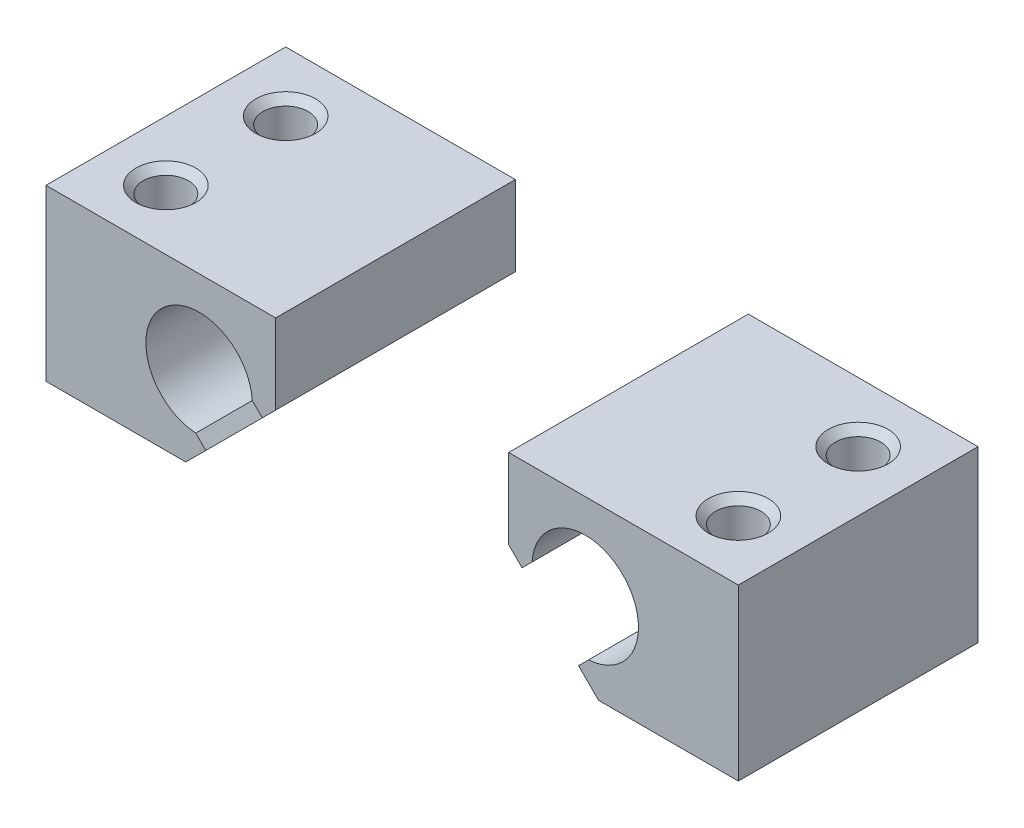
ISO-10303-21;
HEADER;
FILE_DESCRIPTION(('STEP AP214'),'2;1');
FILE_NAME('part.step','',(''),(''),'','','');
FILE_SCHEMA(('AUTOMOTIVE_DESIGN { 1 0 10303 214 1 1 1 1 }'));
ENDSEC;
DATA;
#1=APPLICATION_CONTEXT('core data for automotive mechanical design processes');
#2=APPLICATION_PROTOCOL_DEFINITION('international standard','automotive_design',2000,#1);
#3=PRODUCT_CONTEXT('',#1,'mechanical');
#4=PRODUCT('Part','Part','',(#3));
#5=PRODUCT_RELATED_PRODUCT_CATEGORY('part','',(#4));
#6=PRODUCT_DEFINITION_FORMATION('','',#4);
#7=PRODUCT_DEFINITION_CONTEXT('part definition',#1,'design');
#8=PRODUCT_DEFINITION('design','',#6,#7);
#9=PRODUCT_DEFINITION_SHAPE('','',#8);
#10=(LENGTH_UNIT() NAMED_UNIT(*) SI_UNIT(.MILLI.,.METRE.));
#11=(NAMED_UNIT(*) PLANE_ANGLE_UNIT() SI_UNIT($,.RADIAN.));
#12=(NAMED_UNIT(*) SI_UNIT($,.STERADIAN.) SOLID_ANGLE_UNIT());
#13=UNCERTAINTY_MEASURE_WITH_UNIT(LENGTH_MEASURE(1.E-05),#10,'distance_accuracy_value','');
#14=(GEOMETRIC_REPRESENTATION_CONTEXT(3) GLOBAL_UNCERTAINTY_ASSIGNED_CONTEXT((#13)) GLOBAL_UNIT_ASSIGNED_CONTEXT((#10,
#11,#12)) REPRESENTATION_CONTEXT('',''));
#15=CARTESIAN_POINT('',(0.,0.,0.));
#16=DIRECTION('',(0.,0.,1.));
#17=DIRECTION('',(1.,0.,0.));
#18=AXIS2_PLACEMENT_3D('',#15,#16,#17);
#19=CARTESIAN_POINT('',(-17.5,0.,18.));
#20=DIRECTION('',(0.,-1.,0.));
#21=DIRECTION('',(0.,0.,-1.));
#22=AXIS2_PLACEMENT_3D('',#19,#20,#21);
#23=PLANE('',#22);
#24=CARTESIAN_POINT('',(-43.,0.,-9.));
#25=DIRECTION('',(0.,-1.,0.));
#26=DIRECTION('',(0.,0.,1.));
#27=AXIS2_PLACEMENT_3D('',#24,#25,#26);
#28=CIRCLE('',#27,4.5);
#29=CARTESIAN_POINT('',(-43.,0.,-4.5));
#30=VERTEX_POINT('',#29);
#31=EDGE_CURVE('E227',#30,#30,#28,.T.);
#32=ORIENTED_EDGE('',*,*,#31,.T.);
#33=EDGE_LOOP('',(#32));
#34=FACE_BOUND('',#33,.T.);
#35=CARTESIAN_POINT('',(-43.,0.,9.));
#36=DIRECTION('',(0.,-1.,0.));
#37=DIRECTION('',(0.,0.,1.));
#38=AXIS2_PLACEMENT_3D('',#35,#36,#37);
#39=CIRCLE('',#38,4.5);
#40=CARTESIAN_POINT('',(-43.,0.,13.5));
#41=VERTEX_POINT('',#40);
#42=EDGE_CURVE('E230',#41,#41,#39,.T.);
#43=ORIENTED_EDGE('',*,*,#42,.T.);
#44=EDGE_LOOP('',(#43));
#45=FACE_BOUND('',#44,.T.);
#46=DIRECTION('',(1.,0.,0.));
#47=VECTOR('',#46,1.);
#48=CARTESIAN_POINT('',(-17.5,0.,-18.));
#49=LINE('',#48,#47);
#50=CARTESIAN_POINT('',(-52.,0.,-18.));
#51=VERTEX_POINT('',#50);
#52=CARTESIAN_POINT('',(-17.5,0.,-18.));
#53=VERTEX_POINT('',#52);
#54=EDGE_CURVE('E148',#51,#53,#49,.T.);
#55=ORIENTED_EDGE('',*,*,#54,.F.);
#56=DIRECTION('',(0.,0.,-1.));
#57=VECTOR('',#56,1.);
#58=CARTESIAN_POINT('',(-52.,0.,18.));
#59=LINE('',#58,#57);
#60=CARTESIAN_POINT('',(-52.,0.,18.));
#61=VERTEX_POINT('',#60);
#62=EDGE_CURVE('E147',#61,#51,#59,.T.);
#63=ORIENTED_EDGE('',*,*,#62,.F.);
#64=DIRECTION('',(1.,0.,0.));
#65=VECTOR('',#64,1.);
#66=CARTESIAN_POINT('',(-17.5,0.,18.));
#67=LINE('',#66,#65);
#68=CARTESIAN_POINT('',(-17.5,0.,18.));
#69=VERTEX_POINT('',#68);
#70=EDGE_CURVE('E170',#61,#69,#67,.T.);
#71=ORIENTED_EDGE('',*,*,#70,.T.);
#72=DIRECTION('',(0.,0.,-1.));
#73=VECTOR('',#72,1.);
#74=CARTESIAN_POINT('',(-17.5,0.,18.));
#75=LINE('',#74,#73);
#76=EDGE_CURVE('E12',#69,#53,#75,.T.);
#77=ORIENTED_EDGE('',*,*,#76,.T.);
#78=EDGE_LOOP('',(#55,#63,#71,#77));
#79=FACE_BOUND('',#78,.T.);
#80=ADVANCED_FACE('F46',(#34,#45,#79),#23,.F.);
#81=CARTESIAN_POINT('',(-17.5,-11.9999999999999,18.));
#82=DIRECTION('',(-1.,0.,0.));
#83=DIRECTION('',(0.,1.,0.));
#84=AXIS2_PLACEMENT_3D('',#81,#82,#83);
#85=PLANE('',#84);
#86=DIRECTION('',(0.,-1.,0.));
#87=VECTOR('',#86,1.);
#88=CARTESIAN_POINT('',(-17.5,-11.9999999999999,-18.));
#89=LINE('',#88,#87);
#90=CARTESIAN_POINT('',(-17.5,-11.9999999999999,-18.));
#91=VERTEX_POINT('',#90);
#92=EDGE_CURVE('E150',#53,#91,#89,.T.);
#93=ORIENTED_EDGE('',*,*,#92,.F.);
#94=ORIENTED_EDGE('',*,*,#76,.F.);
#95=DIRECTION('',(0.,-1.,0.));
#96=VECTOR('',#95,1.);
#97=CARTESIAN_POINT('',(-17.5,-11.9999999999999,18.));
#98=LINE('',#97,#96);
#99=CARTESIAN_POINT('',(-17.5,-11.9999999999999,18.));
#100=VERTEX_POINT('',#99);
#101=EDGE_CURVE('E103',#69,#100,#98,.T.);
#102=ORIENTED_EDGE('',*,*,#101,.T.);
#103=DIRECTION('',(0.,0.,-1.));
#104=VECTOR('',#103,1.);
#105=CARTESIAN_POINT('',(-17.5,-11.9999999999999,18.));
#106=LINE('',#105,#104);
#107=EDGE_CURVE('E54',#100,#91,#106,.T.);
#108=ORIENTED_EDGE('',*,*,#107,.T.);
#109=EDGE_LOOP('',(#93,#94,#102,#108));
#110=FACE_BOUND('',#109,.T.);
#111=ADVANCED_FACE('F185',(#110),#85,.F.);
#112=CARTESIAN_POINT('',(-19.5073593128807,-14.0073593128807,18.));
#113=DIRECTION('',(-0.70710678118655,0.707106781186545,0.));
#114=DIRECTION('',(0.707106781186545,0.70710678118655,0.));
#115=AXIS2_PLACEMENT_3D('',#112,#113,#114);
#116=PLANE('',#115);
#117=DIRECTION('',(-0.707106781186545,-0.70710678118655,0.));
#118=VECTOR('',#117,1.);
#119=CARTESIAN_POINT('',(-19.5073593128807,-14.0073593128807,-18.));
#120=LINE('',#119,#118);
#121=CARTESIAN_POINT('',(-19.5073593128807,-14.0073593128807,-18.));
#122=VERTEX_POINT('',#121);
#123=EDGE_CURVE('E154',#91,#122,#120,.T.);
#124=ORIENTED_EDGE('',*,*,#123,.F.);
#125=ORIENTED_EDGE('',*,*,#107,.F.);
#126=DIRECTION('',(-0.707106781186545,-0.70710678118655,0.));
#127=VECTOR('',#126,1.);
#128=CARTESIAN_POINT('',(-19.5073593128807,-14.0073593128807,18.));
#129=LINE('',#128,#127);
#130=CARTESIAN_POINT('',(-19.5073593128807,-14.0073593128807,18.));
#131=VERTEX_POINT('',#130);
#132=EDGE_CURVE('E194',#100,#131,#129,.T.);
#133=ORIENTED_EDGE('',*,*,#132,.T.);
#134=DIRECTION('',(0.,0.,-1.));
#135=VECTOR('',#134,1.);
#136=CARTESIAN_POINT('',(-19.5073593128807,-14.0073593128807,18.));
#137=LINE('',#136,#135);
#138=EDGE_CURVE('E180',#131,#122,#137,.T.);
#139=ORIENTED_EDGE('',*,*,#138,.T.);
#140=EDGE_LOOP('',(#124,#125,#133,#139));
#141=FACE_BOUND('',#140,.T.);
#142=ADVANCED_FACE('F212',(#141),#116,.F.);
#143=CARTESIAN_POINT('',(-19.5073593128807,-14.0073593128807,18.));
#144=DIRECTION('',(0.707106781186544,0.707106781186551,0.));
#145=DIRECTION('',(0.707106781186551,-0.707106781186544,0.));
#146=AXIS2_PLACEMENT_3D('',#143,#144,#145);
#147=PLANE('',#146);
#148=DIRECTION('',(-0.707106781186551,0.707106781186544,0.));
#149=VECTOR('',#148,1.);
#150=CARTESIAN_POINT('',(-19.5073593128807,-14.0073593128807,-18.));
#151=LINE('',#150,#149);
#152=CARTESIAN_POINT('',(-21.0157019261068,-12.4990166996546,-18.));
#153=VERTEX_POINT('',#152);
#154=EDGE_CURVE('E157',#122,#153,#151,.T.);
#155=ORIENTED_EDGE('',*,*,#154,.F.);
#156=ORIENTED_EDGE('',*,*,#138,.F.);
#157=DIRECTION('',(-0.707106781186551,0.707106781186544,0.));
#158=VECTOR('',#157,1.);
#159=CARTESIAN_POINT('',(-19.5073593128807,-14.0073593128807,18.));
#160=LINE('',#159,#158);
#161=CARTESIAN_POINT('',(-21.0157019261068,-12.4990166996546,18.));
#162=VERTEX_POINT('',#161);
#163=EDGE_CURVE('E200',#131,#162,#160,.T.);
#164=ORIENTED_EDGE('',*,*,#163,.T.);
#165=DIRECTION('',(0.,0.,-1.));
#166=VECTOR('',#165,1.);
#167=CARTESIAN_POINT('',(-21.0157019261068,-12.4990166996546,18.));
#168=LINE('',#167,#166);
#169=EDGE_CURVE('E177',#162,#153,#168,.T.);
#170=ORIENTED_EDGE('',*,*,#169,.T.);
#171=EDGE_LOOP('',(#155,#156,#164,#170));
#172=FACE_BOUND('',#171,.T.);
#173=ADVANCED_FACE('F211',(#172),#147,.F.);
#174=CARTESIAN_POINT('',(-29.,-13.,18.));
#175=DIRECTION('',(0.,0.,-1.));
#176=DIRECTION('',(1.,0.,0.));
#177=AXIS2_PLACEMENT_3D('',#174,#175,#176);
#178=CYLINDRICAL_SURFACE('',#177,8.);
#179=CARTESIAN_POINT('',(-29.,-13.,-18.));
#180=DIRECTION('',(0.,0.,1.));
#181=DIRECTION('',(-1.,0.,0.));
#182=AXIS2_PLACEMENT_3D('',#179,#180,#181);
#183=CIRCLE('',#182,8.);
#184=CARTESIAN_POINT('',(-29.5009833003453,-20.9842980738932,-18.));
#185=VERTEX_POINT('',#184);
#186=EDGE_CURVE('E160',#153,#185,#183,.T.);
#187=ORIENTED_EDGE('',*,*,#186,.F.);
#188=ORIENTED_EDGE('',*,*,#169,.F.);
#189=CARTESIAN_POINT('',(-29.,-13.,18.));
#190=DIRECTION('',(0.,0.,1.));
#191=DIRECTION('',(-1.,0.,0.));
#192=AXIS2_PLACEMENT_3D('',#189,#190,#191);
#193=CIRCLE('',#192,8.);
#194=CARTESIAN_POINT('',(-29.5009833003453,-20.9842980738932,18.));
#195=VERTEX_POINT('',#194);
#196=EDGE_CURVE('E142',#162,#195,#193,.T.);
#197=ORIENTED_EDGE('',*,*,#196,.T.);
#198=DIRECTION('',(0.,0.,-1.));
#199=VECTOR('',#198,1.);
#200=CARTESIAN_POINT('',(-29.5009833003453,-20.9842980738932,18.));
#201=LINE('',#200,#199);
#202=EDGE_CURVE('E174',#195,#185,#201,.T.);
#203=ORIENTED_EDGE('',*,*,#202,.T.);
#204=EDGE_LOOP('',(#187,#188,#197,#203));
#205=FACE_BOUND('',#204,.T.);
#206=ADVANCED_FACE('F205',(#205),#178,.F.);
#207=CARTESIAN_POINT('',(-27.9926406871193,-22.4926406871193,18.));
#208=DIRECTION('',(-0.707106781186545,-0.70710678118655,0.));
#209=DIRECTION('',(-0.70710678118655,0.707106781186545,0.));
#210=AXIS2_PLACEMENT_3D('',#207,#208,#209);
#211=PLANE('',#210);
#212=DIRECTION('',(0.70710678118655,-0.707106781186545,0.));
#213=VECTOR('',#212,1.);
#214=CARTESIAN_POINT('',(-27.9926406871193,-22.4926406871193,-18.));
#215=LINE('',#214,#213);
#216=CARTESIAN_POINT('',(-27.9926406871193,-22.4926406871193,-18.));
#217=VERTEX_POINT('',#216);
#218=EDGE_CURVE('E163',#185,#217,#215,.T.);
#219=ORIENTED_EDGE('',*,*,#218,.F.);
#220=ORIENTED_EDGE('',*,*,#202,.F.);
#221=DIRECTION('',(0.70710678118655,-0.707106781186545,0.));
#222=VECTOR('',#221,1.);
#223=CARTESIAN_POINT('',(-27.9926406871193,-22.4926406871193,18.));
#224=LINE('',#223,#222);
#225=CARTESIAN_POINT('',(-27.9926406871193,-22.4926406871193,18.));
#226=VERTEX_POINT('',#225);
#227=EDGE_CURVE('E140',#195,#226,#224,.T.);
#228=ORIENTED_EDGE('',*,*,#227,.T.);
#229=DIRECTION('',(0.,0.,-1.));
#230=VECTOR('',#229,1.);
#231=CARTESIAN_POINT('',(-27.9926406871193,-22.4926406871193,18.));
#232=LINE('',#231,#230);
#233=EDGE_CURVE('E134',#226,#217,#232,.T.);
#234=ORIENTED_EDGE('',*,*,#233,.T.);
#235=EDGE_LOOP('',(#219,#220,#228,#234));
#236=FACE_BOUND('',#235,.T.);
#237=ADVANCED_FACE('F209',(#236),#211,.F.);
#238=CARTESIAN_POINT('',(-31.,-25.5,18.));
#239=DIRECTION('',(-0.707106781186549,0.707106781186546,0.));
#240=DIRECTION('',(0.707106781186546,0.707106781186549,0.));
#241=AXIS2_PLACEMENT_3D('',#238,#239,#240);
#242=PLANE('',#241);
#243=DIRECTION('',(-0.707106781186546,-0.707106781186549,0.));
#244=VECTOR('',#243,1.);
#245=CARTESIAN_POINT('',(-31.,-25.5,-18.));
#246=LINE('',#245,#244);
#247=CARTESIAN_POINT('',(-31.,-25.5,-18.));
#248=VERTEX_POINT('',#247);
#249=EDGE_CURVE('E166',#217,#248,#246,.T.);
#250=ORIENTED_EDGE('',*,*,#249,.F.);
#251=ORIENTED_EDGE('',*,*,#233,.F.);
#252=DIRECTION('',(-0.707106781186546,-0.707106781186549,0.));
#253=VECTOR('',#252,1.);
#254=CARTESIAN_POINT('',(-31.,-25.5,18.));
#255=LINE('',#254,#253);
#256=CARTESIAN_POINT('',(-31.,-25.5,18.));
#257=VERTEX_POINT('',#256);
#258=EDGE_CURVE('E124',#226,#257,#255,.T.);
#259=ORIENTED_EDGE('',*,*,#258,.T.);
#260=DIRECTION('',(0.,0.,-1.));
#261=VECTOR('',#260,1.);
#262=CARTESIAN_POINT('',(-31.,-25.5,18.));
#263=LINE('',#262,#261);
#264=EDGE_CURVE('E129',#257,#248,#263,.T.);
#265=ORIENTED_EDGE('',*,*,#264,.T.);
#266=EDGE_LOOP('',(#250,#251,#259,#265));
#267=FACE_BOUND('',#266,.T.);
#268=ADVANCED_FACE('F137',(#267),#242,.F.);
#269=CARTESIAN_POINT('',(-52.,-25.5,18.));
#270=DIRECTION('',(0.,1.,0.));
#271=DIRECTION('',(1.,0.,0.));
#272=AXIS2_PLACEMENT_3D('',#269,#270,#271);
#273=PLANE('',#272);
#274=CARTESIAN_POINT('',(-43.,-25.5,-9.));
#275=DIRECTION('',(0.,-1.,0.));
#276=DIRECTION('',(0.,0.,1.));
#277=AXIS2_PLACEMENT_3D('',#274,#275,#276);
#278=CIRCLE('',#277,3.39999999999999);
#279=CARTESIAN_POINT('',(-43.,-25.5,-5.60000000000001));
#280=VERTEX_POINT('',#279);
#281=EDGE_CURVE('E233',#280,#280,#278,.T.);
#282=ORIENTED_EDGE('',*,*,#281,.F.);
#283=EDGE_LOOP('',(#282));
#284=FACE_BOUND('',#283,.T.);
#285=CARTESIAN_POINT('',(-43.,-25.5,9.));
#286=DIRECTION('',(0.,-1.,0.));
#287=DIRECTION('',(0.,0.,1.));
#288=AXIS2_PLACEMENT_3D('',#285,#286,#287);
#289=CIRCLE('',#288,3.39999999999999);
#290=CARTESIAN_POINT('',(-43.,-25.5,12.4));
#291=VERTEX_POINT('',#290);
#292=EDGE_CURVE('E151',#291,#291,#289,.T.);
#293=ORIENTED_EDGE('',*,*,#292,.F.);
#294=EDGE_LOOP('',(#293));
#295=FACE_BOUND('',#294,.T.);
#296=DIRECTION('',(-1.,0.,0.));
#297=VECTOR('',#296,1.);
#298=CARTESIAN_POINT('',(-52.,-25.5,-18.));
#299=LINE('',#298,#297);
#300=CARTESIAN_POINT('',(-52.,-25.5,-18.));
#301=VERTEX_POINT('',#300);
#302=EDGE_CURVE('E131',#248,#301,#299,.T.);
#303=ORIENTED_EDGE('',*,*,#302,.F.);
#304=ORIENTED_EDGE('',*,*,#264,.F.);
#305=DIRECTION('',(-1.,0.,0.));
#306=VECTOR('',#305,1.);
#307=CARTESIAN_POINT('',(-52.,-25.5,18.));
#308=LINE('',#307,#306);
#309=CARTESIAN_POINT('',(-52.,-25.5,18.));
#310=VERTEX_POINT('',#309);
#311=EDGE_CURVE('E120',#257,#310,#308,.T.);
#312=ORIENTED_EDGE('',*,*,#311,.T.);
#313=DIRECTION('',(0.,0.,-1.));
#314=VECTOR('',#313,1.);
#315=CARTESIAN_POINT('',(-52.,-25.5,18.));
#316=LINE('',#315,#314);
#317=EDGE_CURVE('E135',#310,#301,#316,.T.);
#318=ORIENTED_EDGE('',*,*,#317,.T.);
#319=EDGE_LOOP('',(#303,#304,#312,#318));
#320=FACE_BOUND('',#319,.T.);
#321=ADVANCED_FACE('F130',(#284,#295,#320),#273,.F.);
#322=CARTESIAN_POINT('',(-52.,0.,18.));
#323=DIRECTION('',(1.,0.,0.));
#324=DIRECTION('',(0.,0.,1.));
#325=AXIS2_PLACEMENT_3D('',#322,#323,#324);
#326=PLANE('',#325);
#327=DIRECTION('',(0.,1.,0.));
#328=VECTOR('',#327,1.);
#329=CARTESIAN_POINT('',(-52.,0.,-18.));
#330=LINE('',#329,#328);
#331=EDGE_CURVE('E91',#301,#51,#330,.T.);
#332=ORIENTED_EDGE('',*,*,#331,.F.);
#333=ORIENTED_EDGE('',*,*,#317,.F.);
#334=DIRECTION('',(0.,1.,0.));
#335=VECTOR('',#334,1.);
#336=CARTESIAN_POINT('',(-52.,0.,18.));
#337=LINE('',#336,#335);
#338=EDGE_CURVE('E62',#310,#61,#337,.T.);
#339=ORIENTED_EDGE('',*,*,#338,.T.);
#340=ORIENTED_EDGE('',*,*,#62,.T.);
#341=EDGE_LOOP('',(#332,#333,#339,#340));
#342=FACE_BOUND('',#341,.T.);
#343=ADVANCED_FACE('F266',(#342),#326,.F.);
#344=CARTESIAN_POINT('',(-29.,-13.,18.));
#345=DIRECTION('',(0.,0.,1.));
#346=DIRECTION('',(-1.,0.,0.));
#347=AXIS2_PLACEMENT_3D('',#344,#345,#346);
#348=PLANE('',#347);
#349=ORIENTED_EDGE('',*,*,#70,.F.);
#350=ORIENTED_EDGE('',*,*,#338,.F.);
#351=ORIENTED_EDGE('',*,*,#311,.F.);
#352=ORIENTED_EDGE('',*,*,#258,.F.);
#353=ORIENTED_EDGE('',*,*,#227,.F.);
#354=ORIENTED_EDGE('',*,*,#196,.F.);
#355=ORIENTED_EDGE('',*,*,#163,.F.);
#356=ORIENTED_EDGE('',*,*,#132,.F.);
#357=ORIENTED_EDGE('',*,*,#101,.F.);
#358=EDGE_LOOP('',(#349,#350,#351,#352,#353,#354,#355,#356,#357));
#359=FACE_BOUND('',#358,.T.);
#360=ADVANCED_FACE('F122',(#359),#348,.T.);
#361=CARTESIAN_POINT('',(-29.,-13.,-18.));
#362=DIRECTION('',(0.,0.,1.));
#363=DIRECTION('',(-1.,0.,0.));
#364=AXIS2_PLACEMENT_3D('',#361,#362,#363);
#365=PLANE('',#364);
#366=ORIENTED_EDGE('',*,*,#54,.T.);
#367=ORIENTED_EDGE('',*,*,#92,.T.);
#368=ORIENTED_EDGE('',*,*,#123,.T.);
#369=ORIENTED_EDGE('',*,*,#154,.T.);
#370=ORIENTED_EDGE('',*,*,#186,.T.);
#371=ORIENTED_EDGE('',*,*,#218,.T.);
#372=ORIENTED_EDGE('',*,*,#249,.T.);
#373=ORIENTED_EDGE('',*,*,#302,.T.);
#374=ORIENTED_EDGE('',*,*,#331,.T.);
#375=EDGE_LOOP('',(#366,#367,#368,#369,#370,#371,#372,#373,#374));
#376=FACE_BOUND('',#375,.T.);
#377=ADVANCED_FACE('F188',(#376),#365,.F.);
#378=CARTESIAN_POINT('',(-43.,0.,9.));
#379=DIRECTION('',(0.,1.,0.));
#380=DIRECTION('',(0.,0.,1.));
#381=AXIS2_PLACEMENT_3D('',#378,#379,#380);
#382=CYLINDRICAL_SURFACE('',#381,3.4);
#383=ORIENTED_EDGE('',*,*,#292,.T.);
#384=EDGE_LOOP('',(#383));
#385=FACE_BOUND('',#384,.T.);
#386=CARTESIAN_POINT('',(-43.,-1.1,9.));
#387=DIRECTION('',(0.,-1.,0.));
#388=DIRECTION('',(0.,0.,1.));
#389=AXIS2_PLACEMENT_3D('',#386,#387,#388);
#390=CIRCLE('',#389,3.4);
#391=CARTESIAN_POINT('',(-43.,-1.1,12.4));
#392=VERTEX_POINT('',#391);
#393=EDGE_CURVE('E232',#392,#392,#390,.T.);
#394=ORIENTED_EDGE('',*,*,#393,.F.);
#395=EDGE_LOOP('',(#394));
#396=FACE_BOUND('',#395,.T.);
#397=ADVANCED_FACE('F257',(#385,#396),#382,.F.);
#398=CARTESIAN_POINT('',(-43.,0.,9.));
#399=DIRECTION('',(0.,1.,0.));
#400=DIRECTION('',(0.,0.,1.));
#401=AXIS2_PLACEMENT_3D('',#398,#399,#400);
#402=CONICAL_SURFACE('',#401,4.5,0.785398163397449);
#403=ORIENTED_EDGE('',*,*,#393,.T.);
#404=EDGE_LOOP('',(#403));
#405=FACE_BOUND('',#404,.T.);
#406=ORIENTED_EDGE('',*,*,#42,.F.);
#407=EDGE_LOOP('',(#406));
#408=FACE_BOUND('',#407,.T.);
#409=ADVANCED_FACE('F249',(#405,#408),#402,.F.);
#410=CARTESIAN_POINT('',(-43.,0.,-9.));
#411=DIRECTION('',(0.,1.,0.));
#412=DIRECTION('',(0.,0.,1.));
#413=AXIS2_PLACEMENT_3D('',#410,#411,#412);
#414=CYLINDRICAL_SURFACE('',#413,3.4);
#415=ORIENTED_EDGE('',*,*,#281,.T.);
#416=EDGE_LOOP('',(#415));
#417=FACE_BOUND('',#416,.T.);
#418=CARTESIAN_POINT('',(-43.,-1.1,-9.));
#419=DIRECTION('',(0.,-1.,0.));
#420=DIRECTION('',(0.,0.,1.));
#421=AXIS2_PLACEMENT_3D('',#418,#419,#420);
#422=CIRCLE('',#421,3.4);
#423=CARTESIAN_POINT('',(-43.,-1.1,-5.6));
#424=VERTEX_POINT('',#423);
#425=EDGE_CURVE('E237',#424,#424,#422,.T.);
#426=ORIENTED_EDGE('',*,*,#425,.F.);
#427=EDGE_LOOP('',(#426));
#428=FACE_BOUND('',#427,.T.);
#429=ADVANCED_FACE('F247',(#417,#428),#414,.F.);
#430=CARTESIAN_POINT('',(-43.,0.,-9.));
#431=DIRECTION('',(0.,1.,0.));
#432=DIRECTION('',(0.,0.,1.));
#433=AXIS2_PLACEMENT_3D('',#430,#431,#432);
#434=CONICAL_SURFACE('',#433,4.5,0.785398163397449);
#435=ORIENTED_EDGE('',*,*,#425,.T.);
#436=EDGE_LOOP('',(#435));
#437=FACE_BOUND('',#436,.T.);
#438=ORIENTED_EDGE('',*,*,#31,.F.);
#439=EDGE_LOOP('',(#438));
#440=FACE_BOUND('',#439,.T.);
#441=ADVANCED_FACE('F244',(#437,#440),#434,.F.);
#442=CLOSED_SHELL('',(#80,#111,#142,#173,#206,#237,#268,#321,#343,#360,#377,#397,#409,#429,#441));
#443=MANIFOLD_SOLID_BREP('B2',#442);
#444=CARTESIAN_POINT('',(17.5,0.,18.));
#445=DIRECTION('',(0.,-1.,0.));
#446=DIRECTION('',(0.,0.,-1.));
#447=AXIS2_PLACEMENT_3D('',#444,#445,#446);
#448=PLANE('',#447);
#449=CARTESIAN_POINT('',(43.,0.,-9.));
#450=DIRECTION('',(0.,1.,0.));
#451=DIRECTION('',(0.,0.,1.));
#452=AXIS2_PLACEMENT_3D('',#449,#450,#451);
#453=CIRCLE('',#452,4.5);
#454=CARTESIAN_POINT('',(43.,0.,-4.5));
#455=VERTEX_POINT('',#454);
#456=EDGE_CURVE('E545',#455,#455,#453,.T.);
#457=ORIENTED_EDGE('',*,*,#456,.F.);
#458=EDGE_LOOP('',(#457));
#459=FACE_BOUND('',#458,.T.);
#460=CARTESIAN_POINT('',(43.,0.,9.));
#461=DIRECTION('',(0.,1.,0.));
#462=DIRECTION('',(0.,0.,1.));
#463=AXIS2_PLACEMENT_3D('',#460,#461,#462);
#464=CIRCLE('',#463,4.5);
#465=CARTESIAN_POINT('',(43.,0.,13.5));
#466=VERTEX_POINT('',#465);
#467=EDGE_CURVE('E536',#466,#466,#464,.T.);
#468=ORIENTED_EDGE('',*,*,#467,.F.);
#469=EDGE_LOOP('',(#468));
#470=FACE_BOUND('',#469,.T.);
#471=DIRECTION('',(-1.,0.,0.));
#472=VECTOR('',#471,1.);
#473=CARTESIAN_POINT('',(17.5,0.,-18.));
#474=LINE('',#473,#472);
#475=CARTESIAN_POINT('',(52.,0.,-18.));
#476=VERTEX_POINT('',#475);
#477=CARTESIAN_POINT('',(17.5,0.,-18.));
#478=VERTEX_POINT('',#477);
#479=EDGE_CURVE('E473',#476,#478,#474,.T.);
#480=ORIENTED_EDGE('',*,*,#479,.T.);
#481=DIRECTION('',(0.,0.,-1.));
#482=VECTOR('',#481,1.);
#483=CARTESIAN_POINT('',(17.5,0.,18.));
#484=LINE('',#483,#482);
#485=CARTESIAN_POINT('',(17.5,0.,18.));
#486=VERTEX_POINT('',#485);
#487=EDGE_CURVE('E44',#486,#478,#484,.T.);
#488=ORIENTED_EDGE('',*,*,#487,.F.);
#489=DIRECTION('',(-1.,0.,0.));
#490=VECTOR('',#489,1.);
#491=CARTESIAN_POINT('',(17.5,0.,18.));
#492=LINE('',#491,#490);
#493=CARTESIAN_POINT('',(52.,0.,18.));
#494=VERTEX_POINT('',#493);
#495=EDGE_CURVE('E490',#494,#486,#492,.T.);
#496=ORIENTED_EDGE('',*,*,#495,.F.);
#497=DIRECTION('',(0.,0.,-1.));
#498=VECTOR('',#497,1.);
#499=CARTESIAN_POINT('',(52.,0.,18.));
#500=LINE('',#499,#498);
#501=EDGE_CURVE('E469',#494,#476,#500,.T.);
#502=ORIENTED_EDGE('',*,*,#501,.T.);
#503=EDGE_LOOP('',(#480,#488,#496,#502));
#504=FACE_BOUND('',#503,.T.);
#505=ADVANCED_FACE('F371',(#459,#470,#504),#448,.F.);
#506=CARTESIAN_POINT('',(17.5,-11.9999999999999,18.));
#507=DIRECTION('',(1.,0.,0.));
#508=DIRECTION('',(0.,1.,0.));
#509=AXIS2_PLACEMENT_3D('',#506,#507,#508);
#510=PLANE('',#509);
#511=DIRECTION('',(0.,-1.,0.));
#512=VECTOR('',#511,1.);
#513=CARTESIAN_POINT('',(17.5,-11.9999999999999,-18.));
#514=LINE('',#513,#512);
#515=CARTESIAN_POINT('',(17.5,-11.9999999999999,-18.));
#516=VERTEX_POINT('',#515);
#517=EDGE_CURVE('E476',#478,#516,#514,.T.);
#518=ORIENTED_EDGE('',*,*,#517,.T.);
#519=DIRECTION('',(0.,0.,-1.));
#520=VECTOR('',#519,1.);
#521=CARTESIAN_POINT('',(17.5,-11.9999999999999,18.));
#522=LINE('',#521,#520);
#523=CARTESIAN_POINT('',(17.5,-11.9999999999999,18.));
#524=VERTEX_POINT('',#523);
#525=EDGE_CURVE('E379',#524,#516,#522,.T.);
#526=ORIENTED_EDGE('',*,*,#525,.F.);
#527=DIRECTION('',(0.,-1.,0.));
#528=VECTOR('',#527,1.);
#529=CARTESIAN_POINT('',(17.5,-11.9999999999999,18.));
#530=LINE('',#529,#528);
#531=EDGE_CURVE('E433',#486,#524,#530,.T.);
#532=ORIENTED_EDGE('',*,*,#531,.F.);
#533=ORIENTED_EDGE('',*,*,#487,.T.);
#534=EDGE_LOOP('',(#518,#526,#532,#533));
#535=FACE_BOUND('',#534,.T.);
#536=ADVANCED_FACE('F553',(#535),#510,.F.);
#537=CARTESIAN_POINT('',(19.5073593128807,-14.0073593128807,18.));
#538=DIRECTION('',(0.70710678118655,0.707106781186545,0.));
#539=DIRECTION('',(-0.707106781186545,0.70710678118655,0.));
#540=AXIS2_PLACEMENT_3D('',#537,#538,#539);
#541=PLANE('',#540);
#542=DIRECTION('',(0.707106781186545,-0.70710678118655,0.));
#543=VECTOR('',#542,1.);
#544=CARTESIAN_POINT('',(19.5073593128807,-14.0073593128807,-18.));
#545=LINE('',#544,#543);
#546=CARTESIAN_POINT('',(19.5073593128807,-14.0073593128807,-18.));
#547=VERTEX_POINT('',#546);
#548=EDGE_CURVE('E479',#516,#547,#545,.T.);
#549=ORIENTED_EDGE('',*,*,#548,.T.);
#550=DIRECTION('',(0.,0.,-1.));
#551=VECTOR('',#550,1.);
#552=CARTESIAN_POINT('',(19.5073593128807,-14.0073593128807,18.));
#553=LINE('',#552,#551);
#554=CARTESIAN_POINT('',(19.5073593128807,-14.0073593128807,18.));
#555=VERTEX_POINT('',#554);
#556=EDGE_CURVE('E500',#555,#547,#553,.T.);
#557=ORIENTED_EDGE('',*,*,#556,.F.);
#558=DIRECTION('',(0.707106781186545,-0.70710678118655,0.));
#559=VECTOR('',#558,1.);
#560=CARTESIAN_POINT('',(19.5073593128807,-14.0073593128807,18.));
#561=LINE('',#560,#559);
#562=EDGE_CURVE('E508',#524,#555,#561,.T.);
#563=ORIENTED_EDGE('',*,*,#562,.F.);
#564=ORIENTED_EDGE('',*,*,#525,.T.);
#565=EDGE_LOOP('',(#549,#557,#563,#564));
#566=FACE_BOUND('',#565,.T.);
#567=ADVANCED_FACE('F506',(#566),#541,.F.);
#568=CARTESIAN_POINT('',(19.5073593128807,-14.0073593128807,18.));
#569=DIRECTION('',(-0.707106781186544,0.707106781186551,0.));
#570=DIRECTION('',(-0.707106781186551,-0.707106781186544,0.));
#571=AXIS2_PLACEMENT_3D('',#568,#569,#570);
#572=PLANE('',#571);
#573=DIRECTION('',(0.707106781186551,0.707106781186544,0.));
#574=VECTOR('',#573,1.);
#575=CARTESIAN_POINT('',(19.5073593128807,-14.0073593128807,-18.));
#576=LINE('',#575,#574);
#577=CARTESIAN_POINT('',(21.0157019261068,-12.4990166996546,-18.));
#578=VERTEX_POINT('',#577);
#579=EDGE_CURVE('E481',#547,#578,#576,.T.);
#580=ORIENTED_EDGE('',*,*,#579,.T.);
#581=DIRECTION('',(0.,0.,-1.));
#582=VECTOR('',#581,1.);
#583=CARTESIAN_POINT('',(21.0157019261068,-12.4990166996546,18.));
#584=LINE('',#583,#582);
#585=CARTESIAN_POINT('',(21.0157019261068,-12.4990166996546,18.));
#586=VERTEX_POINT('',#585);
#587=EDGE_CURVE('E497',#586,#578,#584,.T.);
#588=ORIENTED_EDGE('',*,*,#587,.F.);
#589=DIRECTION('',(0.707106781186551,0.707106781186544,0.));
#590=VECTOR('',#589,1.);
#591=CARTESIAN_POINT('',(19.5073593128807,-14.0073593128807,18.));
#592=LINE('',#591,#590);
#593=EDGE_CURVE('E524',#555,#586,#592,.T.);
#594=ORIENTED_EDGE('',*,*,#593,.F.);
#595=ORIENTED_EDGE('',*,*,#556,.T.);
#596=EDGE_LOOP('',(#580,#588,#594,#595));
#597=FACE_BOUND('',#596,.T.);
#598=ADVANCED_FACE('F517',(#597),#572,.F.);
#599=CARTESIAN_POINT('',(29.,-13.,18.));
#600=DIRECTION('',(0.,0.,-1.));
#601=DIRECTION('',(-1.,0.,0.));
#602=AXIS2_PLACEMENT_3D('',#599,#600,#601);
#603=CYLINDRICAL_SURFACE('',#602,8.);
#604=CARTESIAN_POINT('',(29.,-13.,-18.));
#605=DIRECTION('',(0.,0.,-1.));
#606=DIRECTION('',(1.,0.,0.));
#607=AXIS2_PLACEMENT_3D('',#604,#605,#606);
#608=CIRCLE('',#607,8.);
#609=CARTESIAN_POINT('',(29.5009833003453,-20.9842980738932,-18.));
#610=VERTEX_POINT('',#609);
#611=EDGE_CURVE('E483',#578,#610,#608,.T.);
#612=ORIENTED_EDGE('',*,*,#611,.T.);
#613=DIRECTION('',(0.,0.,-1.));
#614=VECTOR('',#613,1.);
#615=CARTESIAN_POINT('',(29.5009833003453,-20.9842980738932,18.));
#616=LINE('',#615,#614);
#617=CARTESIAN_POINT('',(29.5009833003453,-20.9842980738932,18.));
#618=VERTEX_POINT('',#617);
#619=EDGE_CURVE('E494',#618,#610,#616,.T.);
#620=ORIENTED_EDGE('',*,*,#619,.F.);
#621=CARTESIAN_POINT('',(29.,-13.,18.));
#622=DIRECTION('',(0.,0.,-1.));
#623=DIRECTION('',(1.,0.,0.));
#624=AXIS2_PLACEMENT_3D('',#621,#622,#623);
#625=CIRCLE('',#624,8.);
#626=EDGE_CURVE('E523',#586,#618,#625,.T.);
#627=ORIENTED_EDGE('',*,*,#626,.F.);
#628=ORIENTED_EDGE('',*,*,#587,.T.);
#629=EDGE_LOOP('',(#612,#620,#627,#628));
#630=FACE_BOUND('',#629,.T.);
#631=ADVANCED_FACE('F521',(#630),#603,.F.);
#632=CARTESIAN_POINT('',(27.9926406871193,-22.4926406871193,18.));
#633=DIRECTION('',(0.707106781186545,-0.70710678118655,0.));
#634=DIRECTION('',(0.70710678118655,0.707106781186545,0.));
#635=AXIS2_PLACEMENT_3D('',#632,#633,#634);
#636=PLANE('',#635);
#637=DIRECTION('',(-0.70710678118655,-0.707106781186545,0.));
#638=VECTOR('',#637,1.);
#639=CARTESIAN_POINT('',(27.9926406871193,-22.4926406871193,-18.));
#640=LINE('',#639,#638);
#641=CARTESIAN_POINT('',(27.9926406871193,-22.4926406871193,-18.));
#642=VERTEX_POINT('',#641);
#643=EDGE_CURVE('E485',#610,#642,#640,.T.);
#644=ORIENTED_EDGE('',*,*,#643,.T.);
#645=DIRECTION('',(0.,0.,-1.));
#646=VECTOR('',#645,1.);
#647=CARTESIAN_POINT('',(27.9926406871193,-22.4926406871193,18.));
#648=LINE('',#647,#646);
#649=CARTESIAN_POINT('',(27.9926406871193,-22.4926406871193,18.));
#650=VERTEX_POINT('',#649);
#651=EDGE_CURVE('E464',#650,#642,#648,.T.);
#652=ORIENTED_EDGE('',*,*,#651,.F.);
#653=DIRECTION('',(-0.70710678118655,-0.707106781186545,0.));
#654=VECTOR('',#653,1.);
#655=CARTESIAN_POINT('',(27.9926406871193,-22.4926406871193,18.));
#656=LINE('',#655,#654);
#657=EDGE_CURVE('E455',#618,#650,#656,.T.);
#658=ORIENTED_EDGE('',*,*,#657,.F.);
#659=ORIENTED_EDGE('',*,*,#619,.T.);
#660=EDGE_LOOP('',(#644,#652,#658,#659));
#661=FACE_BOUND('',#660,.T.);
#662=ADVANCED_FACE('F559',(#661),#636,.F.);
#663=CARTESIAN_POINT('',(31.,-25.5,18.));
#664=DIRECTION('',(0.707106781186549,0.707106781186546,0.));
#665=DIRECTION('',(-0.707106781186546,0.707106781186549,0.));
#666=AXIS2_PLACEMENT_3D('',#663,#664,#665);
#667=PLANE('',#666);
#668=DIRECTION('',(0.707106781186546,-0.707106781186549,0.));
#669=VECTOR('',#668,1.);
#670=CARTESIAN_POINT('',(31.,-25.5,-18.));
#671=LINE('',#670,#669);
#672=CARTESIAN_POINT('',(31.,-25.5,-18.));
#673=VERTEX_POINT('',#672);
#674=EDGE_CURVE('E463',#642,#673,#671,.T.);
#675=ORIENTED_EDGE('',*,*,#674,.T.);
#676=DIRECTION('',(0.,0.,-1.));
#677=VECTOR('',#676,1.);
#678=CARTESIAN_POINT('',(31.,-25.5,18.));
#679=LINE('',#678,#677);
#680=CARTESIAN_POINT('',(31.,-25.5,18.));
#681=VERTEX_POINT('',#680);
#682=EDGE_CURVE('E460',#681,#673,#679,.T.);
#683=ORIENTED_EDGE('',*,*,#682,.F.);
#684=DIRECTION('',(0.707106781186546,-0.707106781186549,0.));
#685=VECTOR('',#684,1.);
#686=CARTESIAN_POINT('',(31.,-25.5,18.));
#687=LINE('',#686,#685);
#688=EDGE_CURVE('E449',#650,#681,#687,.T.);
#689=ORIENTED_EDGE('',*,*,#688,.F.);
#690=ORIENTED_EDGE('',*,*,#651,.T.);
#691=EDGE_LOOP('',(#675,#683,#689,#690));
#692=FACE_BOUND('',#691,.T.);
#693=ADVANCED_FACE('F461',(#692),#667,.F.);
#694=CARTESIAN_POINT('',(52.,-25.5,18.));
#695=DIRECTION('',(0.,1.,0.));
#696=DIRECTION('',(-1.,0.,0.));
#697=AXIS2_PLACEMENT_3D('',#694,#695,#696);
#698=PLANE('',#697);
#699=CARTESIAN_POINT('',(43.,-25.5,-9.));
#700=DIRECTION('',(0.,1.,0.));
#701=DIRECTION('',(0.,0.,1.));
#702=AXIS2_PLACEMENT_3D('',#699,#700,#701);
#703=CIRCLE('',#702,3.39999999999999);
#704=CARTESIAN_POINT('',(43.,-25.5,-5.60000000000001));
#705=VERTEX_POINT('',#704);
#706=EDGE_CURVE('E539',#705,#705,#703,.T.);
#707=ORIENTED_EDGE('',*,*,#706,.T.);
#708=EDGE_LOOP('',(#707));
#709=FACE_BOUND('',#708,.T.);
#710=CARTESIAN_POINT('',(43.,-25.5,9.));
#711=DIRECTION('',(0.,1.,0.));
#712=DIRECTION('',(0.,0.,1.));
#713=AXIS2_PLACEMENT_3D('',#710,#711,#712);
#714=CIRCLE('',#713,3.39999999999999);
#715=CARTESIAN_POINT('',(43.,-25.5,12.4));
#716=VERTEX_POINT('',#715);
#717=EDGE_CURVE('E477',#716,#716,#714,.T.);
#718=ORIENTED_EDGE('',*,*,#717,.T.);
#719=EDGE_LOOP('',(#718));
#720=FACE_BOUND('',#719,.T.);
#721=DIRECTION('',(1.,0.,0.));
#722=VECTOR('',#721,1.);
#723=CARTESIAN_POINT('',(52.,-25.5,-18.));
#724=LINE('',#723,#722);
#725=CARTESIAN_POINT('',(52.,-25.5,-18.));
#726=VERTEX_POINT('',#725);
#727=EDGE_CURVE('E419',#673,#726,#724,.T.);
#728=ORIENTED_EDGE('',*,*,#727,.T.);
#729=DIRECTION('',(0.,0.,-1.));
#730=VECTOR('',#729,1.);
#731=CARTESIAN_POINT('',(52.,-25.5,18.));
#732=LINE('',#731,#730);
#733=CARTESIAN_POINT('',(52.,-25.5,18.));
#734=VERTEX_POINT('',#733);
#735=EDGE_CURVE('E465',#734,#726,#732,.T.);
#736=ORIENTED_EDGE('',*,*,#735,.F.);
#737=DIRECTION('',(1.,0.,0.));
#738=VECTOR('',#737,1.);
#739=CARTESIAN_POINT('',(52.,-25.5,18.));
#740=LINE('',#739,#738);
#741=EDGE_CURVE('E453',#681,#734,#740,.T.);
#742=ORIENTED_EDGE('',*,*,#741,.F.);
#743=ORIENTED_EDGE('',*,*,#682,.T.);
#744=EDGE_LOOP('',(#728,#736,#742,#743));
#745=FACE_BOUND('',#744,.T.);
#746=ADVANCED_FACE('F467',(#709,#720,#745),#698,.F.);
#747=CARTESIAN_POINT('',(52.,0.,18.));
#748=DIRECTION('',(-1.,0.,0.));
#749=DIRECTION('',(0.,0.,1.));
#750=AXIS2_PLACEMENT_3D('',#747,#748,#749);
#751=PLANE('',#750);
#752=DIRECTION('',(0.,1.,0.));
#753=VECTOR('',#752,1.);
#754=CARTESIAN_POINT('',(52.,0.,-18.));
#755=LINE('',#754,#753);
#756=EDGE_CURVE('E425',#726,#476,#755,.T.);
#757=ORIENTED_EDGE('',*,*,#756,.T.);
#758=ORIENTED_EDGE('',*,*,#501,.F.);
#759=DIRECTION('',(0.,1.,0.));
#760=VECTOR('',#759,1.);
#761=CARTESIAN_POINT('',(52.,0.,18.));
#762=LINE('',#761,#760);
#763=EDGE_CURVE('E387',#734,#494,#762,.T.);
#764=ORIENTED_EDGE('',*,*,#763,.F.);
#765=ORIENTED_EDGE('',*,*,#735,.T.);
#766=EDGE_LOOP('',(#757,#758,#764,#765));
#767=FACE_BOUND('',#766,.T.);
#768=ADVANCED_FACE('F607',(#767),#751,.F.);
#769=CARTESIAN_POINT('',(29.,-13.,18.));
#770=DIRECTION('',(0.,0.,1.));
#771=DIRECTION('',(1.,0.,0.));
#772=AXIS2_PLACEMENT_3D('',#769,#770,#771);
#773=PLANE('',#772);
#774=ORIENTED_EDGE('',*,*,#495,.T.);
#775=ORIENTED_EDGE('',*,*,#531,.T.);
#776=ORIENTED_EDGE('',*,*,#562,.T.);
#777=ORIENTED_EDGE('',*,*,#593,.T.);
#778=ORIENTED_EDGE('',*,*,#626,.T.);
#779=ORIENTED_EDGE('',*,*,#657,.T.);
#780=ORIENTED_EDGE('',*,*,#688,.T.);
#781=ORIENTED_EDGE('',*,*,#741,.T.);
#782=ORIENTED_EDGE('',*,*,#763,.T.);
#783=EDGE_LOOP('',(#774,#775,#776,#777,#778,#779,#780,#781,#782));
#784=FACE_BOUND('',#783,.T.);
#785=ADVANCED_FACE('F451',(#784),#773,.T.);
#786=CARTESIAN_POINT('',(29.,-13.,-18.));
#787=DIRECTION('',(0.,0.,1.));
#788=DIRECTION('',(1.,0.,0.));
#789=AXIS2_PLACEMENT_3D('',#786,#787,#788);
#790=PLANE('',#789);
#791=ORIENTED_EDGE('',*,*,#479,.F.);
#792=ORIENTED_EDGE('',*,*,#756,.F.);
#793=ORIENTED_EDGE('',*,*,#727,.F.);
#794=ORIENTED_EDGE('',*,*,#674,.F.);
#795=ORIENTED_EDGE('',*,*,#643,.F.);
#796=ORIENTED_EDGE('',*,*,#611,.F.);
#797=ORIENTED_EDGE('',*,*,#579,.F.);
#798=ORIENTED_EDGE('',*,*,#548,.F.);
#799=ORIENTED_EDGE('',*,*,#517,.F.);
#800=EDGE_LOOP('',(#791,#792,#793,#794,#795,#796,#797,#798,#799));
#801=FACE_BOUND('',#800,.T.);
#802=ADVANCED_FACE('F512',(#801),#790,.F.);
#803=CARTESIAN_POINT('',(43.,0.,9.));
#804=DIRECTION('',(0.,1.,0.));
#805=DIRECTION('',(0.,0.,1.));
#806=AXIS2_PLACEMENT_3D('',#803,#804,#805);
#807=CYLINDRICAL_SURFACE('',#806,3.4);
#808=ORIENTED_EDGE('',*,*,#717,.F.);
#809=EDGE_LOOP('',(#808));
#810=FACE_BOUND('',#809,.T.);
#811=CARTESIAN_POINT('',(43.,-1.1,9.));
#812=DIRECTION('',(0.,1.,0.));
#813=DIRECTION('',(0.,0.,1.));
#814=AXIS2_PLACEMENT_3D('',#811,#812,#813);
#815=CIRCLE('',#814,3.4);
#816=CARTESIAN_POINT('',(43.,-1.1,12.4));
#817=VERTEX_POINT('',#816);
#818=EDGE_CURVE('E533',#817,#817,#815,.T.);
#819=ORIENTED_EDGE('',*,*,#818,.T.);
#820=EDGE_LOOP('',(#819));
#821=FACE_BOUND('',#820,.T.);
#822=ADVANCED_FACE('F627',(#810,#821),#807,.F.);
#823=CARTESIAN_POINT('',(43.,0.,9.));
#824=DIRECTION('',(0.,1.,0.));
#825=DIRECTION('',(0.,0.,1.));
#826=AXIS2_PLACEMENT_3D('',#823,#824,#825);
#827=CONICAL_SURFACE('',#826,4.5,0.785398163397449);
#828=ORIENTED_EDGE('',*,*,#818,.F.);
#829=EDGE_LOOP('',(#828));
#830=FACE_BOUND('',#829,.T.);
#831=ORIENTED_EDGE('',*,*,#467,.T.);
#832=EDGE_LOOP('',(#831));
#833=FACE_BOUND('',#832,.T.);
#834=ADVANCED_FACE('F647',(#830,#833),#827,.F.);
#835=CARTESIAN_POINT('',(43.,0.,-9.));
#836=DIRECTION('',(0.,1.,0.));
#837=DIRECTION('',(0.,0.,1.));
#838=AXIS2_PLACEMENT_3D('',#835,#836,#837);
#839=CYLINDRICAL_SURFACE('',#838,3.4);
#840=ORIENTED_EDGE('',*,*,#706,.F.);
#841=EDGE_LOOP('',(#840));
#842=FACE_BOUND('',#841,.T.);
#843=CARTESIAN_POINT('',(43.,-1.1,-9.));
#844=DIRECTION('',(0.,1.,0.));
#845=DIRECTION('',(0.,0.,1.));
#846=AXIS2_PLACEMENT_3D('',#843,#844,#845);
#847=CIRCLE('',#846,3.4);
#848=CARTESIAN_POINT('',(43.,-1.1,-5.6));
#849=VERTEX_POINT('',#848);
#850=EDGE_CURVE('E542',#849,#849,#847,.T.);
#851=ORIENTED_EDGE('',*,*,#850,.T.);
#852=EDGE_LOOP('',(#851));
#853=FACE_BOUND('',#852,.T.);
#854=ADVANCED_FACE('F657',(#842,#853),#839,.F.);
#855=CARTESIAN_POINT('',(43.,0.,-9.));
#856=DIRECTION('',(0.,1.,0.));
#857=DIRECTION('',(0.,0.,1.));
#858=AXIS2_PLACEMENT_3D('',#855,#856,#857);
#859=CONICAL_SURFACE('',#858,4.5,0.785398163397449);
#860=ORIENTED_EDGE('',*,*,#850,.F.);
#861=EDGE_LOOP('',(#860));
#862=FACE_BOUND('',#861,.T.);
#863=ORIENTED_EDGE('',*,*,#456,.T.);
#864=EDGE_LOOP('',(#863));
#865=FACE_BOUND('',#864,.T.);
#866=ADVANCED_FACE('F549',(#862,#865),#859,.F.);
#867=CLOSED_SHELL('',(#505,#536,#567,#598,#631,#662,#693,#746,#768,#785,#802,#822,#834,#854,#866));
#868=MANIFOLD_SOLID_BREP('B6',#867);
#869=ADVANCED_BREP_SHAPE_REPRESENTATION('',(#18,#443,#868),#14);
#870=SHAPE_DEFINITION_REPRESENTATION(#9,#869);
ENDSEC;
END-ISO-10303-21;
